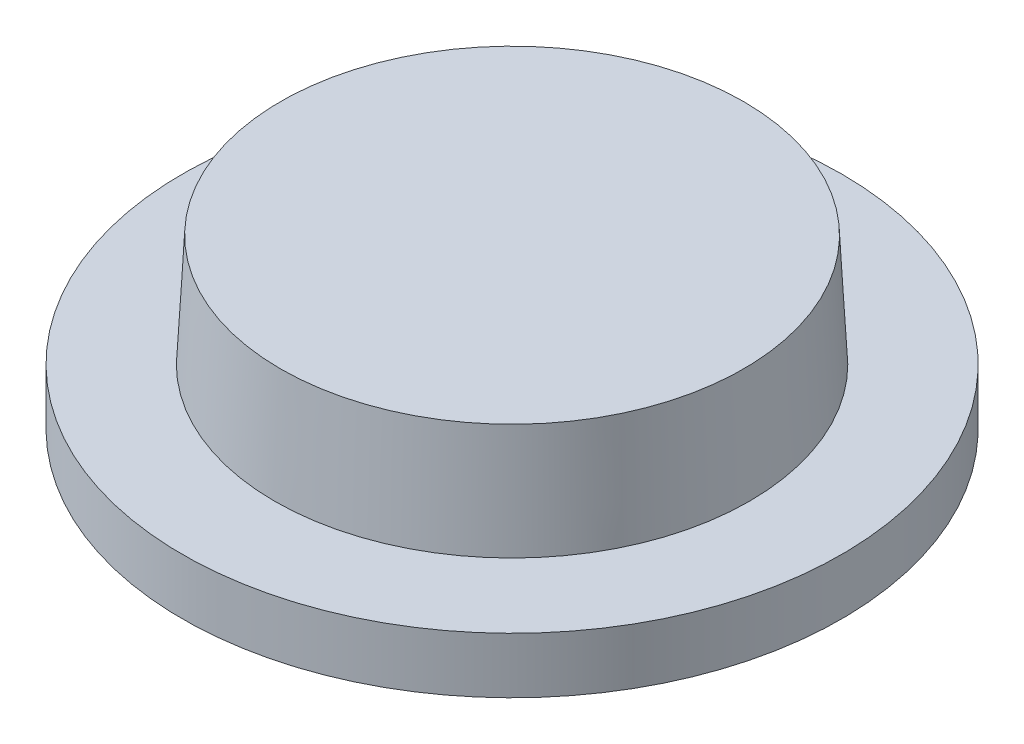
ISO-10303-21;
HEADER;
FILE_DESCRIPTION(('STEP AP214'),'2;1');
FILE_NAME('part.step','',(''),(''),'','','');
FILE_SCHEMA(('AUTOMOTIVE_DESIGN { 1 0 10303 214 1 1 1 1 }'));
ENDSEC;
DATA;
#1=APPLICATION_CONTEXT('core data for automotive mechanical design processes');
#2=APPLICATION_PROTOCOL_DEFINITION('international standard','automotive_design',2000,#1);
#3=PRODUCT_CONTEXT('',#1,'mechanical');
#4=PRODUCT('Part','Part','',(#3));
#5=PRODUCT_RELATED_PRODUCT_CATEGORY('part','',(#4));
#6=PRODUCT_DEFINITION_FORMATION('','',#4);
#7=PRODUCT_DEFINITION_CONTEXT('part definition',#1,'design');
#8=PRODUCT_DEFINITION('design','',#6,#7);
#9=PRODUCT_DEFINITION_SHAPE('','',#8);
#10=(LENGTH_UNIT() NAMED_UNIT(*) SI_UNIT(.MILLI.,.METRE.));
#11=(NAMED_UNIT(*) PLANE_ANGLE_UNIT() SI_UNIT($,.RADIAN.));
#12=(NAMED_UNIT(*) SI_UNIT($,.STERADIAN.) SOLID_ANGLE_UNIT());
#13=UNCERTAINTY_MEASURE_WITH_UNIT(LENGTH_MEASURE(1.E-05),#10,'distance_accuracy_value','');
#14=(GEOMETRIC_REPRESENTATION_CONTEXT(3) GLOBAL_UNCERTAINTY_ASSIGNED_CONTEXT((#13)) GLOBAL_UNIT_ASSIGNED_CONTEXT((#10,
#11,#12)) REPRESENTATION_CONTEXT('',''));
#15=CARTESIAN_POINT('',(0.,0.,0.));
#16=DIRECTION('',(0.,0.,1.));
#17=DIRECTION('',(1.,0.,0.));
#18=AXIS2_PLACEMENT_3D('',#15,#16,#17);
#19=CARTESIAN_POINT('',(0.,0.,0.));
#20=DIRECTION('',(0.,-1.,0.));
#21=DIRECTION('',(0.,0.,1.));
#22=AXIS2_PLACEMENT_3D('',#19,#20,#21);
#23=CONICAL_SURFACE('',#22,2.125,0.05235987755983);
#24=CARTESIAN_POINT('',(0.,1.,0.));
#25=DIRECTION('',(0.,1.,0.));
#26=DIRECTION('',(0.,0.,1.));
#27=AXIS2_PLACEMENT_3D('',#24,#25,#26);
#28=CIRCLE('',#27,2.07259222071696);
#29=CARTESIAN_POINT('',(0.,1.,2.07259222071696));
#30=VERTEX_POINT('',#29);
#31=EDGE_CURVE('E10',#30,#30,#28,.T.);
#32=ORIENTED_EDGE('',*,*,#31,.F.);
#33=EDGE_LOOP('',(#32));
#34=FACE_BOUND('',#33,.T.);
#35=CARTESIAN_POINT('',(0.,0.,0.));
#36=DIRECTION('',(0.,-1.,0.));
#37=DIRECTION('',(0.,0.,-1.));
#38=AXIS2_PLACEMENT_3D('',#35,#36,#37);
#39=CIRCLE('',#38,2.125);
#40=CARTESIAN_POINT('',(0.,0.,-2.125));
#41=VERTEX_POINT('',#40);
#42=EDGE_CURVE('E37',#41,#41,#39,.T.);
#43=ORIENTED_EDGE('',*,*,#42,.F.);
#44=EDGE_LOOP('',(#43));
#45=FACE_BOUND('',#44,.T.);
#46=ADVANCED_FACE('F31',(#34,#45),#23,.T.);
#47=CARTESIAN_POINT('',(0.,1.,0.));
#48=DIRECTION('',(0.,1.,0.));
#49=DIRECTION('',(0.,0.,1.));
#50=AXIS2_PLACEMENT_3D('',#47,#48,#49);
#51=PLANE('',#50);
#52=ORIENTED_EDGE('',*,*,#31,.T.);
#53=EDGE_LOOP('',(#52));
#54=FACE_BOUND('',#53,.T.);
#55=ADVANCED_FACE('F55',(#54),#51,.T.);
#56=CARTESIAN_POINT('',(0.,0.,0.));
#57=DIRECTION('',(0.,-1.,0.));
#58=DIRECTION('',(0.,0.,-1.));
#59=AXIS2_PLACEMENT_3D('',#56,#57,#58);
#60=PLANE('',#59);
#61=CARTESIAN_POINT('',(0.,0.,0.));
#62=DIRECTION('',(0.,-1.,0.));
#63=DIRECTION('',(0.,0.,-1.));
#64=AXIS2_PLACEMENT_3D('',#61,#62,#63);
#65=CIRCLE('',#64,2.95);
#66=CARTESIAN_POINT('',(0.,0.,-2.95));
#67=VERTEX_POINT('',#66);
#68=EDGE_CURVE('E45',#67,#67,#65,.T.);
#69=ORIENTED_EDGE('',*,*,#68,.F.);
#70=EDGE_LOOP('',(#69));
#71=FACE_BOUND('',#70,.T.);
#72=ORIENTED_EDGE('',*,*,#42,.T.);
#73=EDGE_LOOP('',(#72));
#74=FACE_BOUND('',#73,.T.);
#75=ADVANCED_FACE('F53',(#71,#74),#60,.F.);
#76=CARTESIAN_POINT('',(0.,-0.5,0.));
#77=DIRECTION('',(0.,1.,0.));
#78=DIRECTION('',(0.,0.,1.));
#79=AXIS2_PLACEMENT_3D('',#76,#77,#78);
#80=CYLINDRICAL_SURFACE('',#79,2.95);
#81=CARTESIAN_POINT('',(0.,-0.5,0.));
#82=DIRECTION('',(0.,-1.,0.));
#83=DIRECTION('',(0.,0.,-1.));
#84=AXIS2_PLACEMENT_3D('',#81,#82,#83);
#85=CIRCLE('',#84,2.95);
#86=CARTESIAN_POINT('',(0.,-0.5,-2.95));
#87=VERTEX_POINT('',#86);
#88=EDGE_CURVE('E41',#87,#87,#85,.T.);
#89=ORIENTED_EDGE('',*,*,#88,.F.);
#90=EDGE_LOOP('',(#89));
#91=FACE_BOUND('',#90,.T.);
#92=ORIENTED_EDGE('',*,*,#68,.T.);
#93=EDGE_LOOP('',(#92));
#94=FACE_BOUND('',#93,.T.);
#95=ADVANCED_FACE('F51',(#91,#94),#80,.T.);
#96=CARTESIAN_POINT('',(0.,-0.5,0.));
#97=DIRECTION('',(0.,-1.,0.));
#98=DIRECTION('',(0.,0.,-1.));
#99=AXIS2_PLACEMENT_3D('',#96,#97,#98);
#100=PLANE('',#99);
#101=ORIENTED_EDGE('',*,*,#88,.T.);
#102=EDGE_LOOP('',(#101));
#103=FACE_BOUND('',#102,.T.);
#104=ADVANCED_FACE('F61',(#103),#100,.T.);
#105=CLOSED_SHELL('',(#46,#55,#75,#95,#104));
#106=MANIFOLD_SOLID_BREP('B2',#105);
#107=ADVANCED_BREP_SHAPE_REPRESENTATION('',(#18,#106),#14);
#108=SHAPE_DEFINITION_REPRESENTATION(#9,#107);
ENDSEC;
END-ISO-10303-21;
